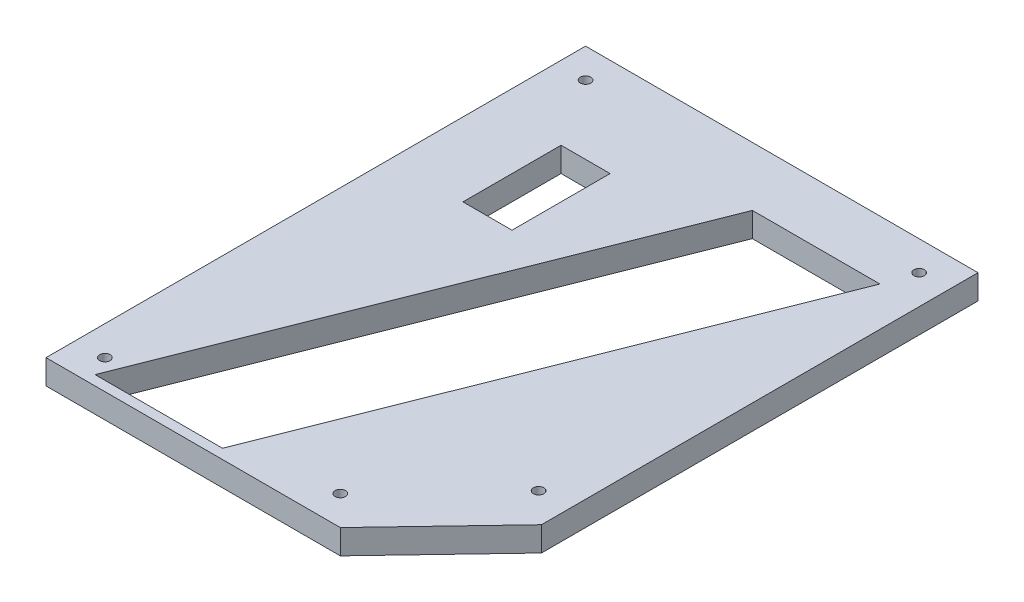
ISO-10303-21;
HEADER;
FILE_DESCRIPTION(('STEP AP214'),'2;1');
FILE_NAME('part.step','',(''),(''),'','','');
FILE_SCHEMA(('AUTOMOTIVE_DESIGN { 1 0 10303 214 1 1 1 1 }'));
ENDSEC;
DATA;
#1=APPLICATION_CONTEXT('core data for automotive mechanical design processes');
#2=APPLICATION_PROTOCOL_DEFINITION('international standard','automotive_design',2000,#1);
#3=PRODUCT_CONTEXT('',#1,'mechanical');
#4=PRODUCT('Part','Part','',(#3));
#5=PRODUCT_RELATED_PRODUCT_CATEGORY('part','',(#4));
#6=PRODUCT_DEFINITION_FORMATION('','',#4);
#7=PRODUCT_DEFINITION_CONTEXT('part definition',#1,'design');
#8=PRODUCT_DEFINITION('design','',#6,#7);
#9=PRODUCT_DEFINITION_SHAPE('','',#8);
#10=(LENGTH_UNIT() NAMED_UNIT(*) SI_UNIT(.MILLI.,.METRE.));
#11=(NAMED_UNIT(*) PLANE_ANGLE_UNIT() SI_UNIT($,.RADIAN.));
#12=(NAMED_UNIT(*) SI_UNIT($,.STERADIAN.) SOLID_ANGLE_UNIT());
#13=UNCERTAINTY_MEASURE_WITH_UNIT(LENGTH_MEASURE(1.E-05),#10,'distance_accuracy_value','');
#14=(GEOMETRIC_REPRESENTATION_CONTEXT(3) GLOBAL_UNCERTAINTY_ASSIGNED_CONTEXT((#13)) GLOBAL_UNIT_ASSIGNED_CONTEXT((#10,
#11,#12)) REPRESENTATION_CONTEXT('',''));
#15=CARTESIAN_POINT('',(0.,0.,0.));
#16=DIRECTION('',(0.,0.,1.));
#17=DIRECTION('',(1.,0.,0.));
#18=AXIS2_PLACEMENT_3D('',#15,#16,#17);
#19=CARTESIAN_POINT('',(-50.8,6.35,63.5));
#20=DIRECTION('',(0.,0.,-1.));
#21=DIRECTION('',(-1.,0.,0.));
#22=AXIS2_PLACEMENT_3D('',#19,#20,#21);
#23=PLANE('',#22);
#24=DIRECTION('',(0.,-1.,0.));
#25=VECTOR('',#24,1.);
#26=CARTESIAN_POINT('',(25.4,230.356689222457,63.5));
#27=LINE('',#26,#25);
#28=CARTESIAN_POINT('',(25.4,6.35,63.5));
#29=VERTEX_POINT('',#28);
#30=CARTESIAN_POINT('',(25.4,0.,63.5));
#31=VERTEX_POINT('',#30);
#32=EDGE_CURVE('E204',#29,#31,#27,.T.);
#33=ORIENTED_EDGE('',*,*,#32,.F.);
#34=DIRECTION('',(1.,0.,0.));
#35=VECTOR('',#34,1.);
#36=CARTESIAN_POINT('',(-50.8,6.35,63.5));
#37=LINE('',#36,#35);
#38=CARTESIAN_POINT('',(-50.8,6.35,63.5));
#39=VERTEX_POINT('',#38);
#40=EDGE_CURVE('E215',#39,#29,#37,.T.);
#41=ORIENTED_EDGE('',*,*,#40,.F.);
#42=DIRECTION('',(0.,-1.,0.));
#43=VECTOR('',#42,1.);
#44=CARTESIAN_POINT('',(-50.8,6.35,63.5));
#45=LINE('',#44,#43);
#46=CARTESIAN_POINT('',(-50.8,0.,63.5));
#47=VERTEX_POINT('',#46);
#48=EDGE_CURVE('E11',#39,#47,#45,.T.);
#49=ORIENTED_EDGE('',*,*,#48,.T.);
#50=DIRECTION('',(1.,0.,0.));
#51=VECTOR('',#50,1.);
#52=CARTESIAN_POINT('',(-50.8,0.,63.5));
#53=LINE('',#52,#51);
#54=EDGE_CURVE('E226',#47,#31,#53,.T.);
#55=ORIENTED_EDGE('',*,*,#54,.T.);
#56=EDGE_LOOP('',(#33,#41,#49,#55));
#57=FACE_BOUND('',#56,.T.);
#58=ADVANCED_FACE('F33',(#57),#23,.F.);
#59=CARTESIAN_POINT('',(50.8,6.35,63.5));
#60=DIRECTION('',(-1.,0.,0.));
#61=DIRECTION('',(0.,0.,1.));
#62=AXIS2_PLACEMENT_3D('',#59,#60,#61);
#63=PLANE('',#62);
#64=DIRECTION('',(0.,-1.,0.));
#65=VECTOR('',#64,1.);
#66=CARTESIAN_POINT('',(50.8,230.356689222457,36.8136734806477));
#67=LINE('',#66,#65);
#68=CARTESIAN_POINT('',(50.8,6.35,36.8136734806477));
#69=VERTEX_POINT('',#68);
#70=CARTESIAN_POINT('',(50.8,0.,36.8136734806477));
#71=VERTEX_POINT('',#70);
#72=EDGE_CURVE('E208',#69,#71,#67,.T.);
#73=ORIENTED_EDGE('',*,*,#72,.T.);
#74=DIRECTION('',(0.,0.,-1.));
#75=VECTOR('',#74,1.);
#76=CARTESIAN_POINT('',(50.8,0.,63.5));
#77=LINE('',#76,#75);
#78=CARTESIAN_POINT('',(50.8,0.,-76.2));
#79=VERTEX_POINT('',#78);
#80=EDGE_CURVE('E229',#71,#79,#77,.T.);
#81=ORIENTED_EDGE('',*,*,#80,.T.);
#82=DIRECTION('',(0.,-1.,0.));
#83=VECTOR('',#82,1.);
#84=CARTESIAN_POINT('',(50.8,6.35,-76.2));
#85=LINE('',#84,#83);
#86=CARTESIAN_POINT('',(50.8,6.35,-76.2));
#87=VERTEX_POINT('',#86);
#88=EDGE_CURVE('E41',#87,#79,#85,.T.);
#89=ORIENTED_EDGE('',*,*,#88,.F.);
#90=DIRECTION('',(0.,0.,-1.));
#91=VECTOR('',#90,1.);
#92=CARTESIAN_POINT('',(50.8,6.35,63.5));
#93=LINE('',#92,#91);
#94=EDGE_CURVE('E219',#69,#87,#93,.T.);
#95=ORIENTED_EDGE('',*,*,#94,.F.);
#96=EDGE_LOOP('',(#73,#81,#89,#95));
#97=FACE_BOUND('',#96,.T.);
#98=ADVANCED_FACE('F251',(#97),#63,.F.);
#99=CARTESIAN_POINT('',(0.,6.35,0.));
#100=DIRECTION('',(0.,-1.,0.));
#101=DIRECTION('',(0.,0.,-1.));
#102=AXIS2_PLACEMENT_3D('',#99,#100,#101);
#103=PLANE('',#102);
#104=CARTESIAN_POINT('',(43.18,6.35,-68.58));
#105=DIRECTION('',(0.,1.,0.));
#106=DIRECTION('',(0.,0.,-1.));
#107=AXIS2_PLACEMENT_3D('',#104,#105,#106);
#108=CIRCLE('',#107,1.35255);
#109=CARTESIAN_POINT('',(43.18,6.35,-69.93255));
#110=VERTEX_POINT('',#109);
#111=EDGE_CURVE('E340',#110,#110,#108,.T.);
#112=ORIENTED_EDGE('',*,*,#111,.F.);
#113=EDGE_LOOP('',(#112));
#114=FACE_BOUND('',#113,.T.);
#115=CARTESIAN_POINT('',(-43.18,6.35,55.88));
#116=DIRECTION('',(0.,1.,0.));
#117=DIRECTION('',(0.,0.,-1.));
#118=AXIS2_PLACEMENT_3D('',#115,#116,#117);
#119=CIRCLE('',#118,1.35255);
#120=CARTESIAN_POINT('',(-43.18,6.35,54.52745));
#121=VERTEX_POINT('',#120);
#122=EDGE_CURVE('E329',#121,#121,#119,.T.);
#123=ORIENTED_EDGE('',*,*,#122,.F.);
#124=EDGE_LOOP('',(#123));
#125=FACE_BOUND('',#124,.T.);
#126=CARTESIAN_POINT('',(17.78,6.35,55.88));
#127=DIRECTION('',(0.,1.,0.));
#128=DIRECTION('',(0.,0.,1.));
#129=AXIS2_PLACEMENT_3D('',#126,#127,#128);
#130=CIRCLE('',#129,1.35255);
#131=CARTESIAN_POINT('',(17.78,6.35,57.23255));
#132=VERTEX_POINT('',#131);
#133=EDGE_CURVE('E325',#132,#132,#130,.T.);
#134=ORIENTED_EDGE('',*,*,#133,.F.);
#135=EDGE_LOOP('',(#134));
#136=FACE_BOUND('',#135,.T.);
#137=CARTESIAN_POINT('',(42.8131507368477,6.35,29.5791010089889));
#138=DIRECTION('',(0.,1.,0.));
#139=DIRECTION('',(0.,0.,-1.));
#140=AXIS2_PLACEMENT_3D('',#137,#138,#139);
#141=CIRCLE('',#140,1.35255);
#142=CARTESIAN_POINT('',(42.8131507368477,6.35,28.2265510089889));
#143=VERTEX_POINT('',#142);
#144=EDGE_CURVE('E332',#143,#143,#141,.T.);
#145=ORIENTED_EDGE('',*,*,#144,.F.);
#146=EDGE_LOOP('',(#145));
#147=FACE_BOUND('',#146,.T.);
#148=CARTESIAN_POINT('',(-43.18,6.35,-68.58));
#149=DIRECTION('',(0.,1.,0.));
#150=DIRECTION('',(0.,0.,1.));
#151=AXIS2_PLACEMENT_3D('',#148,#149,#150);
#152=CIRCLE('',#151,1.35255);
#153=CARTESIAN_POINT('',(-43.18,6.35,-67.22745));
#154=VERTEX_POINT('',#153);
#155=EDGE_CURVE('E152',#154,#154,#152,.T.);
#156=ORIENTED_EDGE('',*,*,#155,.F.);
#157=EDGE_LOOP('',(#156));
#158=FACE_BOUND('',#157,.T.);
#159=DIRECTION('',(-1.,0.,0.));
#160=VECTOR('',#159,1.);
#161=CARTESIAN_POINT('',(-31.75,6.35,-50.8));
#162=LINE('',#161,#160);
#163=CARTESIAN_POINT('',(-19.05,6.35,-50.8));
#164=VERTEX_POINT('',#163);
#165=CARTESIAN_POINT('',(-31.75,6.35,-50.8));
#166=VERTEX_POINT('',#165);
#167=EDGE_CURVE('E158',#164,#166,#162,.T.);
#168=ORIENTED_EDGE('',*,*,#167,.F.);
#169=DIRECTION('',(0.,0.,-1.));
#170=VECTOR('',#169,1.);
#171=CARTESIAN_POINT('',(-19.05,6.35,-25.4));
#172=LINE('',#171,#170);
#173=CARTESIAN_POINT('',(-19.05,6.35,-25.4));
#174=VERTEX_POINT('',#173);
#175=EDGE_CURVE('E48',#174,#164,#172,.T.);
#176=ORIENTED_EDGE('',*,*,#175,.F.);
#177=DIRECTION('',(1.,0.,0.));
#178=VECTOR('',#177,1.);
#179=CARTESIAN_POINT('',(-31.75,6.35,-25.4));
#180=LINE('',#179,#178);
#181=CARTESIAN_POINT('',(-31.75,6.35,-25.4));
#182=VERTEX_POINT('',#181);
#183=EDGE_CURVE('E146',#182,#174,#180,.T.);
#184=ORIENTED_EDGE('',*,*,#183,.F.);
#185=DIRECTION('',(0.,0.,1.));
#186=VECTOR('',#185,1.);
#187=CARTESIAN_POINT('',(-31.75,6.35,-25.4));
#188=LINE('',#187,#186);
#189=EDGE_CURVE('E149',#166,#182,#188,.T.);
#190=ORIENTED_EDGE('',*,*,#189,.F.);
#191=EDGE_LOOP('',(#168,#176,#184,#190));
#192=FACE_BOUND('',#191,.T.);
#193=DIRECTION('',(1.,0.,0.));
#194=VECTOR('',#193,1.);
#195=CARTESIAN_POINT('',(-40.64,6.35,60.96));
#196=LINE('',#195,#194);
#197=CARTESIAN_POINT('',(-40.64,6.35,60.96));
#198=VERTEX_POINT('',#197);
#199=CARTESIAN_POINT('',(-7.62,6.35,60.96));
#200=VERTEX_POINT('',#199);
#201=EDGE_CURVE('E184',#198,#200,#196,.T.);
#202=ORIENTED_EDGE('',*,*,#201,.F.);
#203=DIRECTION('',(-0.368048451007378,0.,0.929806613071272));
#204=VECTOR('',#203,1.);
#205=CARTESIAN_POINT('',(-40.64,6.35,60.96));
#206=LINE('',#205,#204);
#207=CARTESIAN_POINT('',(7.62,6.35,-60.96));
#208=VERTEX_POINT('',#207);
#209=EDGE_CURVE('E165',#208,#198,#206,.T.);
#210=ORIENTED_EDGE('',*,*,#209,.F.);
#211=DIRECTION('',(-1.,0.,0.));
#212=VECTOR('',#211,1.);
#213=CARTESIAN_POINT('',(7.62,6.35,-60.96));
#214=LINE('',#213,#212);
#215=CARTESIAN_POINT('',(40.64,6.35,-60.96));
#216=VERTEX_POINT('',#215);
#217=EDGE_CURVE('E173',#216,#208,#214,.T.);
#218=ORIENTED_EDGE('',*,*,#217,.F.);
#219=DIRECTION('',(0.368048451007378,0.,-0.929806613071272));
#220=VECTOR('',#219,1.);
#221=CARTESIAN_POINT('',(-7.62,6.35,60.96));
#222=LINE('',#221,#220);
#223=EDGE_CURVE('E187',#200,#216,#222,.T.);
#224=ORIENTED_EDGE('',*,*,#223,.F.);
#225=EDGE_LOOP('',(#202,#210,#218,#224));
#226=FACE_BOUND('',#225,.T.);
#227=DIRECTION('',(0.689433827791875,0.,-0.724348670942554));
#228=VECTOR('',#227,1.);
#229=CARTESIAN_POINT('',(50.8,6.34999999999999,36.8136734806477));
#230=LINE('',#229,#228);
#231=EDGE_CURVE('E194',#29,#69,#230,.T.);
#232=ORIENTED_EDGE('',*,*,#231,.T.);
#233=ORIENTED_EDGE('',*,*,#94,.T.);
#234=DIRECTION('',(-1.,0.,0.));
#235=VECTOR('',#234,1.);
#236=CARTESIAN_POINT('',(-50.8,6.35,-76.2));
#237=LINE('',#236,#235);
#238=CARTESIAN_POINT('',(-50.8,6.35,-76.2));
#239=VERTEX_POINT('',#238);
#240=EDGE_CURVE('E221',#87,#239,#237,.T.);
#241=ORIENTED_EDGE('',*,*,#240,.T.);
#242=DIRECTION('',(0.,0.,1.));
#243=VECTOR('',#242,1.);
#244=CARTESIAN_POINT('',(-50.8,6.35,63.5));
#245=LINE('',#244,#243);
#246=EDGE_CURVE('E212',#239,#39,#245,.T.);
#247=ORIENTED_EDGE('',*,*,#246,.T.);
#248=ORIENTED_EDGE('',*,*,#40,.T.);
#249=EDGE_LOOP('',(#232,#233,#241,#247,#248));
#250=FACE_BOUND('',#249,.T.);
#251=ADVANCED_FACE('F248',(#114,#125,#136,#147,#158,#192,#226,#250),#103,.F.);
#252=CARTESIAN_POINT('',(-50.8,6.35,63.5));
#253=DIRECTION('',(1.,0.,0.));
#254=DIRECTION('',(0.,0.,-1.));
#255=AXIS2_PLACEMENT_3D('',#252,#253,#254);
#256=PLANE('',#255);
#257=DIRECTION('',(0.,0.,1.));
#258=VECTOR('',#257,1.);
#259=CARTESIAN_POINT('',(-50.8,0.,63.5));
#260=LINE('',#259,#258);
#261=CARTESIAN_POINT('',(-50.8,0.,-76.2));
#262=VERTEX_POINT('',#261);
#263=EDGE_CURVE('E211',#262,#47,#260,.T.);
#264=ORIENTED_EDGE('',*,*,#263,.T.);
#265=ORIENTED_EDGE('',*,*,#48,.F.);
#266=ORIENTED_EDGE('',*,*,#246,.F.);
#267=DIRECTION('',(0.,-1.,0.));
#268=VECTOR('',#267,1.);
#269=CARTESIAN_POINT('',(-50.8,6.35,-76.2));
#270=LINE('',#269,#268);
#271=EDGE_CURVE('E223',#239,#262,#270,.T.);
#272=ORIENTED_EDGE('',*,*,#271,.T.);
#273=EDGE_LOOP('',(#264,#265,#266,#272));
#274=FACE_BOUND('',#273,.T.);
#275=ADVANCED_FACE('F35',(#274),#256,.F.);
#276=CARTESIAN_POINT('',(-50.8,6.35,-76.2));
#277=DIRECTION('',(0.,0.,1.));
#278=DIRECTION('',(1.,0.,0.));
#279=AXIS2_PLACEMENT_3D('',#276,#277,#278);
#280=PLANE('',#279);
#281=DIRECTION('',(-1.,0.,0.));
#282=VECTOR('',#281,1.);
#283=CARTESIAN_POINT('',(-50.8,0.,-76.2));
#284=LINE('',#283,#282);
#285=EDGE_CURVE('E216',#79,#262,#284,.T.);
#286=ORIENTED_EDGE('',*,*,#285,.T.);
#287=ORIENTED_EDGE('',*,*,#271,.F.);
#288=ORIENTED_EDGE('',*,*,#240,.F.);
#289=ORIENTED_EDGE('',*,*,#88,.T.);
#290=EDGE_LOOP('',(#286,#287,#288,#289));
#291=FACE_BOUND('',#290,.T.);
#292=ADVANCED_FACE('F238',(#291),#280,.F.);
#293=CARTESIAN_POINT('',(0.,0.,0.));
#294=DIRECTION('',(0.,-1.,0.));
#295=DIRECTION('',(0.,0.,-1.));
#296=AXIS2_PLACEMENT_3D('',#293,#294,#295);
#297=PLANE('',#296);
#298=CARTESIAN_POINT('',(43.18,0.,-68.58));
#299=DIRECTION('',(0.,1.,0.));
#300=DIRECTION('',(0.,0.,-1.));
#301=AXIS2_PLACEMENT_3D('',#298,#299,#300);
#302=CIRCLE('',#301,1.35255);
#303=CARTESIAN_POINT('',(43.18,0.,-69.93255));
#304=VERTEX_POINT('',#303);
#305=EDGE_CURVE('E337',#304,#304,#302,.T.);
#306=ORIENTED_EDGE('',*,*,#305,.T.);
#307=EDGE_LOOP('',(#306));
#308=FACE_BOUND('',#307,.T.);
#309=CARTESIAN_POINT('',(-43.18,0.,55.88));
#310=DIRECTION('',(0.,1.,0.));
#311=DIRECTION('',(0.,0.,-1.));
#312=AXIS2_PLACEMENT_3D('',#309,#310,#311);
#313=CIRCLE('',#312,1.35255);
#314=CARTESIAN_POINT('',(-43.18,0.,54.52745));
#315=VERTEX_POINT('',#314);
#316=EDGE_CURVE('E343',#315,#315,#313,.T.);
#317=ORIENTED_EDGE('',*,*,#316,.T.);
#318=EDGE_LOOP('',(#317));
#319=FACE_BOUND('',#318,.T.);
#320=CARTESIAN_POINT('',(17.78,0.,55.88));
#321=DIRECTION('',(0.,1.,0.));
#322=DIRECTION('',(0.,0.,1.));
#323=AXIS2_PLACEMENT_3D('',#320,#321,#322);
#324=CIRCLE('',#323,1.35255);
#325=CARTESIAN_POINT('',(17.78,0.,57.23255));
#326=VERTEX_POINT('',#325);
#327=EDGE_CURVE('E322',#326,#326,#324,.T.);
#328=ORIENTED_EDGE('',*,*,#327,.T.);
#329=EDGE_LOOP('',(#328));
#330=FACE_BOUND('',#329,.T.);
#331=CARTESIAN_POINT('',(42.8131507368477,0.,29.5791010089889));
#332=DIRECTION('',(0.,1.,0.));
#333=DIRECTION('',(0.,0.,-1.));
#334=AXIS2_PLACEMENT_3D('',#331,#332,#333);
#335=CIRCLE('',#334,1.35255);
#336=CARTESIAN_POINT('',(42.8131507368477,0.,28.2265510089889));
#337=VERTEX_POINT('',#336);
#338=EDGE_CURVE('E327',#337,#337,#335,.T.);
#339=ORIENTED_EDGE('',*,*,#338,.T.);
#340=EDGE_LOOP('',(#339));
#341=FACE_BOUND('',#340,.T.);
#342=CARTESIAN_POINT('',(-43.18,0.,-68.58));
#343=DIRECTION('',(0.,1.,0.));
#344=DIRECTION('',(0.,0.,1.));
#345=AXIS2_PLACEMENT_3D('',#342,#343,#344);
#346=CIRCLE('',#345,1.35255);
#347=CARTESIAN_POINT('',(-43.18,0.,-67.22745));
#348=VERTEX_POINT('',#347);
#349=EDGE_CURVE('E159',#348,#348,#346,.T.);
#350=ORIENTED_EDGE('',*,*,#349,.T.);
#351=EDGE_LOOP('',(#350));
#352=FACE_BOUND('',#351,.T.);
#353=DIRECTION('',(0.,0.,-1.));
#354=VECTOR('',#353,1.);
#355=CARTESIAN_POINT('',(-19.05,0.,-25.4));
#356=LINE('',#355,#354);
#357=CARTESIAN_POINT('',(-19.05,0.,-25.4));
#358=VERTEX_POINT('',#357);
#359=CARTESIAN_POINT('',(-19.05,0.,-50.8));
#360=VERTEX_POINT('',#359);
#361=EDGE_CURVE('E130',#358,#360,#356,.T.);
#362=ORIENTED_EDGE('',*,*,#361,.T.);
#363=DIRECTION('',(-1.,0.,0.));
#364=VECTOR('',#363,1.);
#365=CARTESIAN_POINT('',(-31.75,0.,-50.8));
#366=LINE('',#365,#364);
#367=CARTESIAN_POINT('',(-31.75,0.,-50.8));
#368=VERTEX_POINT('',#367);
#369=EDGE_CURVE('E139',#360,#368,#366,.T.);
#370=ORIENTED_EDGE('',*,*,#369,.T.);
#371=DIRECTION('',(0.,0.,1.));
#372=VECTOR('',#371,1.);
#373=CARTESIAN_POINT('',(-31.75,0.,-25.4));
#374=LINE('',#373,#372);
#375=CARTESIAN_POINT('',(-31.75,0.,-25.4));
#376=VERTEX_POINT('',#375);
#377=EDGE_CURVE('E56',#368,#376,#374,.T.);
#378=ORIENTED_EDGE('',*,*,#377,.T.);
#379=DIRECTION('',(1.,0.,0.));
#380=VECTOR('',#379,1.);
#381=CARTESIAN_POINT('',(-31.75,0.,-25.4));
#382=LINE('',#381,#380);
#383=EDGE_CURVE('E136',#376,#358,#382,.T.);
#384=ORIENTED_EDGE('',*,*,#383,.T.);
#385=EDGE_LOOP('',(#362,#370,#378,#384));
#386=FACE_BOUND('',#385,.T.);
#387=DIRECTION('',(-0.368048451007378,0.,0.929806613071272));
#388=VECTOR('',#387,1.);
#389=CARTESIAN_POINT('',(-40.64,0.,60.96));
#390=LINE('',#389,#388);
#391=CARTESIAN_POINT('',(7.62,0.,-60.96));
#392=VERTEX_POINT('',#391);
#393=CARTESIAN_POINT('',(-40.64,0.,60.96));
#394=VERTEX_POINT('',#393);
#395=EDGE_CURVE('E169',#392,#394,#390,.T.);
#396=ORIENTED_EDGE('',*,*,#395,.T.);
#397=DIRECTION('',(1.,0.,0.));
#398=VECTOR('',#397,1.);
#399=CARTESIAN_POINT('',(-40.64,0.,60.96));
#400=LINE('',#399,#398);
#401=CARTESIAN_POINT('',(-7.62,0.,60.96));
#402=VERTEX_POINT('',#401);
#403=EDGE_CURVE('E172',#394,#402,#400,.T.);
#404=ORIENTED_EDGE('',*,*,#403,.T.);
#405=DIRECTION('',(0.368048451007378,0.,-0.929806613071272));
#406=VECTOR('',#405,1.);
#407=CARTESIAN_POINT('',(-7.62,0.,60.96));
#408=LINE('',#407,#406);
#409=CARTESIAN_POINT('',(40.64,0.,-60.96));
#410=VERTEX_POINT('',#409);
#411=EDGE_CURVE('E176',#402,#410,#408,.T.);
#412=ORIENTED_EDGE('',*,*,#411,.T.);
#413=DIRECTION('',(-1.,0.,0.));
#414=VECTOR('',#413,1.);
#415=CARTESIAN_POINT('',(7.62,0.,-60.96));
#416=LINE('',#415,#414);
#417=EDGE_CURVE('E179',#410,#392,#416,.T.);
#418=ORIENTED_EDGE('',*,*,#417,.T.);
#419=EDGE_LOOP('',(#396,#404,#412,#418));
#420=FACE_BOUND('',#419,.T.);
#421=DIRECTION('',(0.689433827791875,0.,-0.724348670942554));
#422=VECTOR('',#421,1.);
#423=CARTESIAN_POINT('',(50.8,0.,36.8136734806477));
#424=LINE('',#423,#422);
#425=EDGE_CURVE('E201',#31,#71,#424,.T.);
#426=ORIENTED_EDGE('',*,*,#425,.F.);
#427=ORIENTED_EDGE('',*,*,#54,.F.);
#428=ORIENTED_EDGE('',*,*,#263,.F.);
#429=ORIENTED_EDGE('',*,*,#285,.F.);
#430=ORIENTED_EDGE('',*,*,#80,.F.);
#431=EDGE_LOOP('',(#426,#427,#428,#429,#430));
#432=FACE_BOUND('',#431,.T.);
#433=ADVANCED_FACE('F143',(#308,#319,#330,#341,#352,#386,#420,#432),#297,.T.);
#434=CARTESIAN_POINT('',(50.8,230.356689222457,36.8136734806477));
#435=DIRECTION('',(0.724348670942554,0.,0.689433827791875));
#436=DIRECTION('',(0.689433827791875,0.,-0.724348670942554));
#437=AXIS2_PLACEMENT_3D('',#434,#435,#436);
#438=PLANE('',#437);
#439=ORIENTED_EDGE('',*,*,#231,.F.);
#440=ORIENTED_EDGE('',*,*,#32,.T.);
#441=ORIENTED_EDGE('',*,*,#425,.T.);
#442=ORIENTED_EDGE('',*,*,#72,.F.);
#443=EDGE_LOOP('',(#439,#440,#441,#442));
#444=FACE_BOUND('',#443,.T.);
#445=ADVANCED_FACE('F253',(#444),#438,.T.);
#446=CARTESIAN_POINT('',(-40.64,0.,60.96));
#447=DIRECTION('',(-0.929806613071272,0.,-0.368048451007378));
#448=DIRECTION('',(-0.368048451007378,0.,0.929806613071272));
#449=AXIS2_PLACEMENT_3D('',#446,#447,#448);
#450=PLANE('',#449);
#451=ORIENTED_EDGE('',*,*,#209,.T.);
#452=DIRECTION('',(0.,1.,0.));
#453=VECTOR('',#452,1.);
#454=CARTESIAN_POINT('',(-40.64,0.,60.96));
#455=LINE('',#454,#453);
#456=EDGE_CURVE('E182',#394,#198,#455,.T.);
#457=ORIENTED_EDGE('',*,*,#456,.F.);
#458=ORIENTED_EDGE('',*,*,#395,.F.);
#459=DIRECTION('',(0.,1.,0.));
#460=VECTOR('',#459,1.);
#461=CARTESIAN_POINT('',(7.62,0.,-60.96));
#462=LINE('',#461,#460);
#463=EDGE_CURVE('E192',#392,#208,#462,.T.);
#464=ORIENTED_EDGE('',*,*,#463,.T.);
#465=EDGE_LOOP('',(#451,#457,#458,#464));
#466=FACE_BOUND('',#465,.T.);
#467=ADVANCED_FACE('F271',(#466),#450,.F.);
#468=CARTESIAN_POINT('',(7.62,0.,-60.96));
#469=DIRECTION('',(0.,0.,-1.));
#470=DIRECTION('',(-1.,0.,0.));
#471=AXIS2_PLACEMENT_3D('',#468,#469,#470);
#472=PLANE('',#471);
#473=ORIENTED_EDGE('',*,*,#217,.T.);
#474=ORIENTED_EDGE('',*,*,#463,.F.);
#475=ORIENTED_EDGE('',*,*,#417,.F.);
#476=DIRECTION('',(0.,1.,0.));
#477=VECTOR('',#476,1.);
#478=CARTESIAN_POINT('',(40.64,0.,-60.96));
#479=LINE('',#478,#477);
#480=EDGE_CURVE('E195',#410,#216,#479,.T.);
#481=ORIENTED_EDGE('',*,*,#480,.T.);
#482=EDGE_LOOP('',(#473,#474,#475,#481));
#483=FACE_BOUND('',#482,.T.);
#484=ADVANCED_FACE('F274',(#483),#472,.F.);
#485=CARTESIAN_POINT('',(-7.62,0.,60.96));
#486=DIRECTION('',(0.929806613071272,0.,0.368048451007378));
#487=DIRECTION('',(0.368048451007378,0.,-0.929806613071272));
#488=AXIS2_PLACEMENT_3D('',#485,#486,#487);
#489=PLANE('',#488);
#490=ORIENTED_EDGE('',*,*,#223,.T.);
#491=ORIENTED_EDGE('',*,*,#480,.F.);
#492=ORIENTED_EDGE('',*,*,#411,.F.);
#493=DIRECTION('',(0.,1.,0.));
#494=VECTOR('',#493,1.);
#495=CARTESIAN_POINT('',(-7.62,0.,60.96));
#496=LINE('',#495,#494);
#497=EDGE_CURVE('E197',#402,#200,#496,.T.);
#498=ORIENTED_EDGE('',*,*,#497,.T.);
#499=EDGE_LOOP('',(#490,#491,#492,#498));
#500=FACE_BOUND('',#499,.T.);
#501=ADVANCED_FACE('F279',(#500),#489,.F.);
#502=CARTESIAN_POINT('',(-40.64,0.,60.96));
#503=DIRECTION('',(0.,0.,1.));
#504=DIRECTION('',(1.,0.,0.));
#505=AXIS2_PLACEMENT_3D('',#502,#503,#504);
#506=PLANE('',#505);
#507=ORIENTED_EDGE('',*,*,#201,.T.);
#508=ORIENTED_EDGE('',*,*,#497,.F.);
#509=ORIENTED_EDGE('',*,*,#403,.F.);
#510=ORIENTED_EDGE('',*,*,#456,.T.);
#511=EDGE_LOOP('',(#507,#508,#509,#510));
#512=FACE_BOUND('',#511,.T.);
#513=ADVANCED_FACE('F276',(#512),#506,.F.);
#514=CARTESIAN_POINT('',(-19.05,0.,-25.4));
#515=DIRECTION('',(1.,0.,0.));
#516=DIRECTION('',(0.,0.,-1.));
#517=AXIS2_PLACEMENT_3D('',#514,#515,#516);
#518=PLANE('',#517);
#519=ORIENTED_EDGE('',*,*,#175,.T.);
#520=DIRECTION('',(0.,1.,0.));
#521=VECTOR('',#520,1.);
#522=CARTESIAN_POINT('',(-19.05,0.,-50.8));
#523=LINE('',#522,#521);
#524=EDGE_CURVE('E126',#360,#164,#523,.T.);
#525=ORIENTED_EDGE('',*,*,#524,.F.);
#526=ORIENTED_EDGE('',*,*,#361,.F.);
#527=DIRECTION('',(0.,1.,0.));
#528=VECTOR('',#527,1.);
#529=CARTESIAN_POINT('',(-19.05,0.,-25.4));
#530=LINE('',#529,#528);
#531=EDGE_CURVE('E163',#358,#174,#530,.T.);
#532=ORIENTED_EDGE('',*,*,#531,.T.);
#533=EDGE_LOOP('',(#519,#525,#526,#532));
#534=FACE_BOUND('',#533,.T.);
#535=ADVANCED_FACE('F128',(#534),#518,.F.);
#536=CARTESIAN_POINT('',(-31.75,0.,-25.4));
#537=DIRECTION('',(0.,0.,1.));
#538=DIRECTION('',(1.,0.,0.));
#539=AXIS2_PLACEMENT_3D('',#536,#537,#538);
#540=PLANE('',#539);
#541=ORIENTED_EDGE('',*,*,#183,.T.);
#542=ORIENTED_EDGE('',*,*,#531,.F.);
#543=ORIENTED_EDGE('',*,*,#383,.F.);
#544=DIRECTION('',(0.,1.,0.));
#545=VECTOR('',#544,1.);
#546=CARTESIAN_POINT('',(-31.75,0.,-25.4));
#547=LINE('',#546,#545);
#548=EDGE_CURVE('E166',#376,#182,#547,.T.);
#549=ORIENTED_EDGE('',*,*,#548,.T.);
#550=EDGE_LOOP('',(#541,#542,#543,#549));
#551=FACE_BOUND('',#550,.T.);
#552=ADVANCED_FACE('F289',(#551),#540,.F.);
#553=CARTESIAN_POINT('',(-31.75,0.,-25.4));
#554=DIRECTION('',(-1.,0.,0.));
#555=DIRECTION('',(0.,0.,1.));
#556=AXIS2_PLACEMENT_3D('',#553,#554,#555);
#557=PLANE('',#556);
#558=ORIENTED_EDGE('',*,*,#189,.T.);
#559=ORIENTED_EDGE('',*,*,#548,.F.);
#560=ORIENTED_EDGE('',*,*,#377,.F.);
#561=DIRECTION('',(0.,1.,0.));
#562=VECTOR('',#561,1.);
#563=CARTESIAN_POINT('',(-31.75,0.,-50.8));
#564=LINE('',#563,#562);
#565=EDGE_CURVE('E135',#368,#166,#564,.T.);
#566=ORIENTED_EDGE('',*,*,#565,.T.);
#567=EDGE_LOOP('',(#558,#559,#560,#566));
#568=FACE_BOUND('',#567,.T.);
#569=ADVANCED_FACE('F293',(#568),#557,.F.);
#570=CARTESIAN_POINT('',(-31.75,0.,-50.8));
#571=DIRECTION('',(0.,0.,-1.));
#572=DIRECTION('',(-1.,0.,0.));
#573=AXIS2_PLACEMENT_3D('',#570,#571,#572);
#574=PLANE('',#573);
#575=ORIENTED_EDGE('',*,*,#167,.T.);
#576=ORIENTED_EDGE('',*,*,#565,.F.);
#577=ORIENTED_EDGE('',*,*,#369,.F.);
#578=ORIENTED_EDGE('',*,*,#524,.T.);
#579=EDGE_LOOP('',(#575,#576,#577,#578));
#580=FACE_BOUND('',#579,.T.);
#581=ADVANCED_FACE('F140',(#580),#574,.F.);
#582=CARTESIAN_POINT('',(-43.18,0.,-68.58));
#583=DIRECTION('',(0.,1.,0.));
#584=DIRECTION('',(0.,0.,1.));
#585=AXIS2_PLACEMENT_3D('',#582,#583,#584);
#586=CYLINDRICAL_SURFACE('',#585,1.35255);
#587=ORIENTED_EDGE('',*,*,#349,.F.);
#588=EDGE_LOOP('',(#587));
#589=FACE_BOUND('',#588,.T.);
#590=ORIENTED_EDGE('',*,*,#155,.T.);
#591=EDGE_LOOP('',(#590));
#592=FACE_BOUND('',#591,.T.);
#593=ADVANCED_FACE('F292',(#589,#592),#586,.F.);
#594=CARTESIAN_POINT('',(42.8131507368477,0.,29.5791010089889));
#595=DIRECTION('',(0.,1.,0.));
#596=DIRECTION('',(0.,0.,1.));
#597=AXIS2_PLACEMENT_3D('',#594,#595,#596);
#598=CYLINDRICAL_SURFACE('',#597,1.35255);
#599=ORIENTED_EDGE('',*,*,#338,.F.);
#600=EDGE_LOOP('',(#599));
#601=FACE_BOUND('',#600,.T.);
#602=ORIENTED_EDGE('',*,*,#144,.T.);
#603=EDGE_LOOP('',(#602));
#604=FACE_BOUND('',#603,.T.);
#605=ADVANCED_FACE('F301',(#601,#604),#598,.F.);
#606=CARTESIAN_POINT('',(17.78,0.,55.88));
#607=DIRECTION('',(0.,1.,0.));
#608=DIRECTION('',(0.,0.,1.));
#609=AXIS2_PLACEMENT_3D('',#606,#607,#608);
#610=CYLINDRICAL_SURFACE('',#609,1.35255);
#611=ORIENTED_EDGE('',*,*,#327,.F.);
#612=EDGE_LOOP('',(#611));
#613=FACE_BOUND('',#612,.T.);
#614=ORIENTED_EDGE('',*,*,#133,.T.);
#615=EDGE_LOOP('',(#614));
#616=FACE_BOUND('',#615,.T.);
#617=ADVANCED_FACE('F307',(#613,#616),#610,.F.);
#618=CARTESIAN_POINT('',(-43.18,0.,55.88));
#619=DIRECTION('',(0.,1.,0.));
#620=DIRECTION('',(0.,0.,1.));
#621=AXIS2_PLACEMENT_3D('',#618,#619,#620);
#622=CYLINDRICAL_SURFACE('',#621,1.35255);
#623=ORIENTED_EDGE('',*,*,#316,.F.);
#624=EDGE_LOOP('',(#623));
#625=FACE_BOUND('',#624,.T.);
#626=ORIENTED_EDGE('',*,*,#122,.T.);
#627=EDGE_LOOP('',(#626));
#628=FACE_BOUND('',#627,.T.);
#629=ADVANCED_FACE('F303',(#625,#628),#622,.F.);
#630=CARTESIAN_POINT('',(43.18,0.,-68.58));
#631=DIRECTION('',(0.,1.,0.));
#632=DIRECTION('',(0.,0.,1.));
#633=AXIS2_PLACEMENT_3D('',#630,#631,#632);
#634=CYLINDRICAL_SURFACE('',#633,1.35255);
#635=ORIENTED_EDGE('',*,*,#305,.F.);
#636=EDGE_LOOP('',(#635));
#637=FACE_BOUND('',#636,.T.);
#638=ORIENTED_EDGE('',*,*,#111,.T.);
#639=EDGE_LOOP('',(#638));
#640=FACE_BOUND('',#639,.T.);
#641=ADVANCED_FACE('F306',(#637,#640),#634,.F.);
#642=CLOSED_SHELL('',(#58,#98,#251,#275,#292,#433,#445,#467,#484,#501,#513,#535,#552,#569,#581,
#593,#605,#617,#629,#641));
#643=MANIFOLD_SOLID_BREP('B2',#642);
#644=ADVANCED_BREP_SHAPE_REPRESENTATION('',(#18,#643),#14);
#645=SHAPE_DEFINITION_REPRESENTATION(#9,#644);
ENDSEC;
END-ISO-10303-21;
